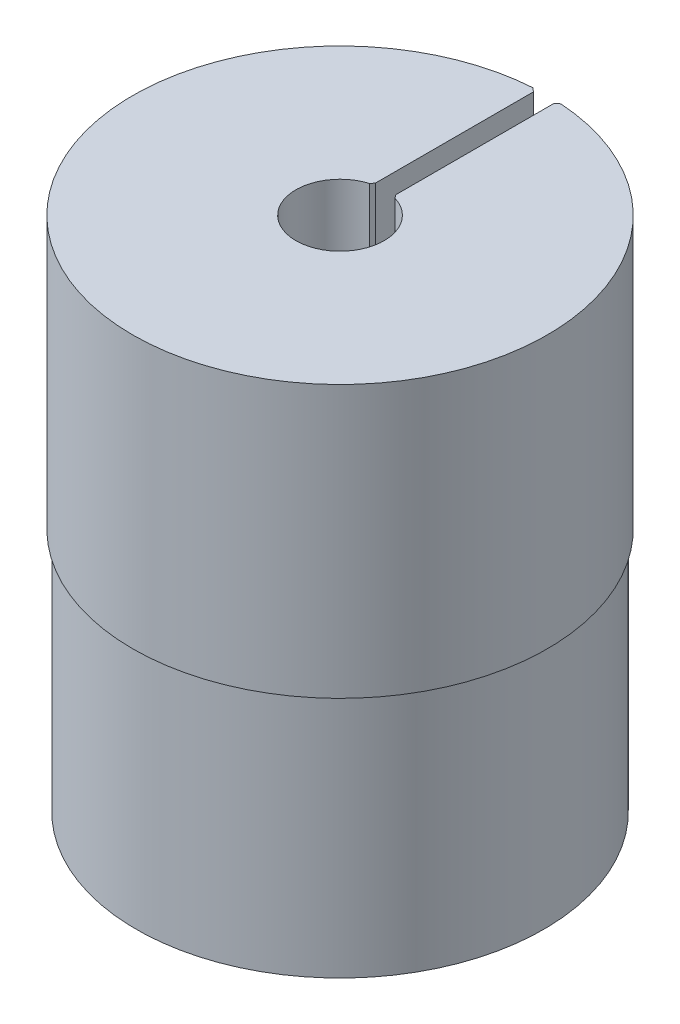
ISO-10303-21;
HEADER;
FILE_DESCRIPTION(('STEP AP214'),'2;1');
FILE_NAME('part.step','',(''),(''),'','','');
FILE_SCHEMA(('AUTOMOTIVE_DESIGN { 1 0 10303 214 1 1 1 1 }'));
ENDSEC;
DATA;
#1=APPLICATION_CONTEXT('core data for automotive mechanical design processes');
#2=APPLICATION_PROTOCOL_DEFINITION('international standard','automotive_design',2000,#1);
#3=PRODUCT_CONTEXT('',#1,'mechanical');
#4=PRODUCT('Part','Part','',(#3));
#5=PRODUCT_RELATED_PRODUCT_CATEGORY('part','',(#4));
#6=PRODUCT_DEFINITION_FORMATION('','',#4);
#7=PRODUCT_DEFINITION_CONTEXT('part definition',#1,'design');
#8=PRODUCT_DEFINITION('design','',#6,#7);
#9=PRODUCT_DEFINITION_SHAPE('','',#8);
#10=(LENGTH_UNIT() NAMED_UNIT(*) SI_UNIT(.MILLI.,.METRE.));
#11=(NAMED_UNIT(*) PLANE_ANGLE_UNIT() SI_UNIT($,.RADIAN.));
#12=(NAMED_UNIT(*) SI_UNIT($,.STERADIAN.) SOLID_ANGLE_UNIT());
#13=UNCERTAINTY_MEASURE_WITH_UNIT(LENGTH_MEASURE(1.E-05),#10,'distance_accuracy_value','');
#14=(GEOMETRIC_REPRESENTATION_CONTEXT(3) GLOBAL_UNCERTAINTY_ASSIGNED_CONTEXT((#13)) GLOBAL_UNIT_ASSIGNED_CONTEXT((#10,
#11,#12)) REPRESENTATION_CONTEXT('',''));
#15=CARTESIAN_POINT('',(0.,0.,0.));
#16=DIRECTION('',(0.,0.,1.));
#17=DIRECTION('',(1.,0.,0.));
#18=AXIS2_PLACEMENT_3D('',#15,#16,#17);
#19=CARTESIAN_POINT('',(0.,9.,0.));
#20=DIRECTION('',(0.,-1.,0.));
#21=DIRECTION('',(0.,0.,-1.));
#22=AXIS2_PLACEMENT_3D('',#19,#20,#21);
#23=CYLINDRICAL_SURFACE('',#22,7.5);
#24=CARTESIAN_POINT('',(0.,0.,0.));
#25=DIRECTION('',(0.,1.,0.));
#26=DIRECTION('',(0.,0.,1.));
#27=AXIS2_PLACEMENT_3D('',#24,#25,#26);
#28=CIRCLE('',#27,7.5);
#29=CARTESIAN_POINT('',(-0.500000000000001,0.,-7.48331477354788));
#30=VERTEX_POINT('',#29);
#31=CARTESIAN_POINT('',(0.499999999999999,0.,-7.48331477354788));
#32=VERTEX_POINT('',#31);
#33=EDGE_CURVE('E214',#30,#32,#28,.T.);
#34=ORIENTED_EDGE('',*,*,#33,.T.);
#35=DIRECTION('',(0.,-1.,0.));
#36=VECTOR('',#35,1.);
#37=CARTESIAN_POINT('',(0.499999999999999,9.,-7.48331477354788));
#38=LINE('',#37,#36);
#39=CARTESIAN_POINT('',(0.499999999999999,9.,-7.48331477354788));
#40=VERTEX_POINT('',#39);
#41=EDGE_CURVE('E207',#32,#40,#38,.F.);
#42=ORIENTED_EDGE('',*,*,#41,.T.);
#43=CARTESIAN_POINT('',(0.,9.,0.));
#44=DIRECTION('',(0.,1.,0.));
#45=DIRECTION('',(0.,0.,1.));
#46=AXIS2_PLACEMENT_3D('',#43,#44,#45);
#47=CIRCLE('',#46,7.5);
#48=CARTESIAN_POINT('',(-0.500000000000001,9.,-7.48331477354788));
#49=VERTEX_POINT('',#48);
#50=EDGE_CURVE('E217',#49,#40,#47,.T.);
#51=ORIENTED_EDGE('',*,*,#50,.F.);
#52=DIRECTION('',(0.,-1.,0.));
#53=VECTOR('',#52,1.);
#54=CARTESIAN_POINT('',(-0.500000000000001,9.,-7.48331477354788));
#55=LINE('',#54,#53);
#56=EDGE_CURVE('E201',#49,#30,#55,.T.);
#57=ORIENTED_EDGE('',*,*,#56,.T.);
#58=EDGE_LOOP('',(#34,#42,#51,#57));
#59=FACE_BOUND('',#58,.T.);
#60=ADVANCED_FACE('F35',(#59),#23,.T.);
#61=CARTESIAN_POINT('',(0.,0.,0.));
#62=DIRECTION('',(0.,1.,0.));
#63=DIRECTION('',(0.,0.,1.));
#64=AXIS2_PLACEMENT_3D('',#61,#62,#63);
#65=PLANE('',#64);
#66=CARTESIAN_POINT('',(0.,0.,0.));
#67=DIRECTION('',(0.,1.,0.));
#68=DIRECTION('',(0.,0.,1.));
#69=AXIS2_PLACEMENT_3D('',#66,#67,#68);
#70=CIRCLE('',#69,1.75);
#71=CARTESIAN_POINT('',(-0.5,0.,-1.67705098312484));
#72=VERTEX_POINT('',#71);
#73=CARTESIAN_POINT('',(0.5,0.,-1.67705098312484));
#74=VERTEX_POINT('',#73);
#75=EDGE_CURVE('E211',#72,#74,#70,.T.);
#76=ORIENTED_EDGE('',*,*,#75,.T.);
#77=DIRECTION('',(0.,0.,-1.));
#78=VECTOR('',#77,1.);
#79=CARTESIAN_POINT('',(0.499999999999999,0.,-7.76458951533139));
#80=LINE('',#79,#78);
#81=EDGE_CURVE('E49',#74,#32,#80,.T.);
#82=ORIENTED_EDGE('',*,*,#81,.T.);
#83=ORIENTED_EDGE('',*,*,#33,.F.);
#84=DIRECTION('',(0.,0.,1.));
#85=VECTOR('',#84,1.);
#86=CARTESIAN_POINT('',(-0.500000000000001,0.,-7.76458951533139));
#87=LINE('',#86,#85);
#88=EDGE_CURVE('E198',#30,#72,#87,.T.);
#89=ORIENTED_EDGE('',*,*,#88,.T.);
#90=EDGE_LOOP('',(#76,#82,#83,#89));
#91=FACE_BOUND('',#90,.T.);
#92=ADVANCED_FACE('F224',(#91),#65,.F.);
#93=CARTESIAN_POINT('',(0.,0.,0.));
#94=DIRECTION('',(0.,1.,0.));
#95=DIRECTION('',(0.,0.,1.));
#96=AXIS2_PLACEMENT_3D('',#93,#94,#95);
#97=CYLINDRICAL_SURFACE('',#96,1.75);
#98=CARTESIAN_POINT('',(0.,9.,0.));
#99=DIRECTION('',(0.,1.,0.));
#100=DIRECTION('',(0.,0.,1.));
#101=AXIS2_PLACEMENT_3D('',#98,#99,#100);
#102=CIRCLE('',#101,1.75);
#103=CARTESIAN_POINT('',(-0.5,9.,-1.67705098312484));
#104=VERTEX_POINT('',#103);
#105=CARTESIAN_POINT('',(0.5,9.,-1.67705098312484));
#106=VERTEX_POINT('',#105);
#107=EDGE_CURVE('E210',#104,#106,#102,.T.);
#108=ORIENTED_EDGE('',*,*,#107,.T.);
#109=DIRECTION('',(0.,1.,0.));
#110=VECTOR('',#109,1.);
#111=CARTESIAN_POINT('',(0.5,0.,-1.67705098312484));
#112=LINE('',#111,#110);
#113=EDGE_CURVE('E11',#106,#74,#112,.F.);
#114=ORIENTED_EDGE('',*,*,#113,.T.);
#115=ORIENTED_EDGE('',*,*,#75,.F.);
#116=DIRECTION('',(0.,1.,0.));
#117=VECTOR('',#116,1.);
#118=CARTESIAN_POINT('',(-0.5,0.,-1.67705098312484));
#119=LINE('',#118,#117);
#120=EDGE_CURVE('E42',#72,#104,#119,.T.);
#121=ORIENTED_EDGE('',*,*,#120,.T.);
#122=EDGE_LOOP('',(#108,#114,#115,#121));
#123=FACE_BOUND('',#122,.T.);
#124=ADVANCED_FACE('F222',(#123),#97,.F.);
#125=CARTESIAN_POINT('',(-0.500000000000001,0.,-7.76458951533139));
#126=DIRECTION('',(-1.,0.,0.));
#127=DIRECTION('',(0.,0.,1.));
#128=AXIS2_PLACEMENT_3D('',#125,#126,#127);
#129=PLANE('',#128);
#130=DIRECTION('',(0.,0.,1.));
#131=VECTOR('',#130,1.);
#132=CARTESIAN_POINT('',(-0.500000000000001,9.,-7.76458951533139));
#133=LINE('',#132,#131);
#134=EDGE_CURVE('E199',#49,#104,#133,.T.);
#135=ORIENTED_EDGE('',*,*,#134,.T.);
#136=ORIENTED_EDGE('',*,*,#120,.F.);
#137=ORIENTED_EDGE('',*,*,#88,.F.);
#138=ORIENTED_EDGE('',*,*,#56,.F.);
#139=EDGE_LOOP('',(#135,#136,#137,#138));
#140=FACE_BOUND('',#139,.T.);
#141=ADVANCED_FACE('F227',(#140),#129,.F.);
#142=CARTESIAN_POINT('',(0.499999999999999,0.,-7.76458951533139));
#143=DIRECTION('',(1.,0.,0.));
#144=DIRECTION('',(0.,0.,-1.));
#145=AXIS2_PLACEMENT_3D('',#142,#143,#144);
#146=PLANE('',#145);
#147=ORIENTED_EDGE('',*,*,#81,.F.);
#148=ORIENTED_EDGE('',*,*,#113,.F.);
#149=DIRECTION('',(0.,0.,-1.));
#150=VECTOR('',#149,1.);
#151=CARTESIAN_POINT('',(0.499999999999999,9.,-7.76458951533139));
#152=LINE('',#151,#150);
#153=EDGE_CURVE('E134',#106,#40,#152,.T.);
#154=ORIENTED_EDGE('',*,*,#153,.T.);
#155=ORIENTED_EDGE('',*,*,#41,.F.);
#156=EDGE_LOOP('',(#147,#148,#154,#155));
#157=FACE_BOUND('',#156,.T.);
#158=ADVANCED_FACE('F232',(#157),#146,.F.);
#159=CARTESIAN_POINT('',(0.,9.,0.));
#160=DIRECTION('',(0.,1.,0.));
#161=DIRECTION('',(0.,0.,1.));
#162=AXIS2_PLACEMENT_3D('',#159,#160,#161);
#163=PLANE('',#162);
#164=CARTESIAN_POINT('',(0.,9.,0.));
#165=DIRECTION('',(0.,1.,0.));
#166=DIRECTION('',(0.,0.,1.));
#167=AXIS2_PLACEMENT_3D('',#164,#165,#166);
#168=CIRCLE('',#167,1.623);
#169=CARTESIAN_POINT('',(-0.463714285714286,9.,-1.55534499749235));
#170=VERTEX_POINT('',#169);
#171=CARTESIAN_POINT('',(0.463714285714285,9.,-1.55534499749235));
#172=VERTEX_POINT('',#171);
#173=EDGE_CURVE('E130',#170,#172,#168,.T.);
#174=ORIENTED_EDGE('',*,*,#173,.T.);
#175=DIRECTION('',(-0.597614304667196,0.,-0.801783725737274));
#176=VECTOR('',#175,1.);
#177=CARTESIAN_POINT('',(1.04335714285714,9.,-0.777672498746174));
#178=LINE('',#177,#176);
#179=CARTESIAN_POINT('',(0.373,9.,-1.67705098312484));
#180=VERTEX_POINT('',#179);
#181=EDGE_CURVE('E149',#172,#180,#178,.T.);
#182=ORIENTED_EDGE('',*,*,#181,.T.);
#183=DIRECTION('',(0.,0.,-1.));
#184=VECTOR('',#183,1.);
#185=CARTESIAN_POINT('',(0.373,9.,0.));
#186=LINE('',#185,#184);
#187=CARTESIAN_POINT('',(0.372999999999999,9.,-7.48331477354788));
#188=VERTEX_POINT('',#187);
#189=EDGE_CURVE('E152',#180,#188,#186,.T.);
#190=ORIENTED_EDGE('',*,*,#189,.T.);
#191=DIRECTION('',(0.730296743340216,0.,-0.683130051063979));
#192=VECTOR('',#191,1.);
#193=CARTESIAN_POINT('',(-3.55926666666667,9.,-3.80501611852325));
#194=LINE('',#193,#192);
#195=CARTESIAN_POINT('',(0.508466666666665,9.,-7.61003223704663));
#196=VERTEX_POINT('',#195);
#197=EDGE_CURVE('E179',#188,#196,#194,.T.);
#198=ORIENTED_EDGE('',*,*,#197,.T.);
#199=CARTESIAN_POINT('',(0.,9.,0.));
#200=DIRECTION('',(0.,1.,0.));
#201=DIRECTION('',(0.,0.,1.));
#202=AXIS2_PLACEMENT_3D('',#199,#200,#201);
#203=CIRCLE('',#202,7.627);
#204=CARTESIAN_POINT('',(-0.508466666666668,9.,-7.61003223704663));
#205=VERTEX_POINT('',#204);
#206=EDGE_CURVE('E176',#205,#196,#203,.T.);
#207=ORIENTED_EDGE('',*,*,#206,.F.);
#208=DIRECTION('',(-0.730296743340219,0.,-0.683130051063976));
#209=VECTOR('',#208,1.);
#210=CARTESIAN_POINT('',(3.55926666666667,9.,-3.80501611852329));
#211=LINE('',#210,#209);
#212=CARTESIAN_POINT('',(-0.373000000000001,9.,-7.48331477354788));
#213=VERTEX_POINT('',#212);
#214=EDGE_CURVE('E174',#213,#205,#211,.T.);
#215=ORIENTED_EDGE('',*,*,#214,.F.);
#216=DIRECTION('',(0.,0.,1.));
#217=VECTOR('',#216,1.);
#218=CARTESIAN_POINT('',(-0.373,9.,0.));
#219=LINE('',#218,#217);
#220=CARTESIAN_POINT('',(-0.373,9.,-1.67705098312484));
#221=VERTEX_POINT('',#220);
#222=EDGE_CURVE('E171',#213,#221,#219,.T.);
#223=ORIENTED_EDGE('',*,*,#222,.T.);
#224=DIRECTION('',(0.597614304667197,0.,-0.801783725737273));
#225=VECTOR('',#224,1.);
#226=CARTESIAN_POINT('',(-1.04335714285714,9.,-0.777672498746178));
#227=LINE('',#226,#225);
#228=EDGE_CURVE('E169',#170,#221,#227,.T.);
#229=ORIENTED_EDGE('',*,*,#228,.F.);
#230=EDGE_LOOP('',(#174,#182,#190,#198,#207,#215,#223,#229));
#231=FACE_BOUND('',#230,.T.);
#232=ORIENTED_EDGE('',*,*,#107,.F.);
#233=ORIENTED_EDGE('',*,*,#134,.F.);
#234=ORIENTED_EDGE('',*,*,#50,.T.);
#235=ORIENTED_EDGE('',*,*,#153,.F.);
#236=EDGE_LOOP('',(#232,#233,#234,#235));
#237=FACE_BOUND('',#236,.T.);
#238=ADVANCED_FACE('F231',(#231,#237),#163,.F.);
#239=CARTESIAN_POINT('',(0.,19.,0.));
#240=DIRECTION('',(0.,-1.,0.));
#241=DIRECTION('',(0.,0.,-1.));
#242=AXIS2_PLACEMENT_3D('',#239,#240,#241);
#243=CYLINDRICAL_SURFACE('',#242,1.623);
#244=ORIENTED_EDGE('',*,*,#173,.F.);
#245=DIRECTION('',(0.,-1.,0.));
#246=VECTOR('',#245,1.);
#247=CARTESIAN_POINT('',(-0.463714285714286,19.,-1.55534499749235));
#248=LINE('',#247,#246);
#249=CARTESIAN_POINT('',(-0.463714285714286,19.,-1.55534499749235));
#250=VERTEX_POINT('',#249);
#251=EDGE_CURVE('E123',#250,#170,#248,.T.);
#252=ORIENTED_EDGE('',*,*,#251,.F.);
#253=CARTESIAN_POINT('',(0.,19.,0.));
#254=DIRECTION('',(0.,1.,0.));
#255=DIRECTION('',(0.,0.,1.));
#256=AXIS2_PLACEMENT_3D('',#253,#254,#255);
#257=CIRCLE('',#256,1.623);
#258=CARTESIAN_POINT('',(0.463714285714285,19.,-1.55534499749235));
#259=VERTEX_POINT('',#258);
#260=EDGE_CURVE('E127',#250,#259,#257,.T.);
#261=ORIENTED_EDGE('',*,*,#260,.T.);
#262=DIRECTION('',(0.,-1.,0.));
#263=VECTOR('',#262,1.);
#264=CARTESIAN_POINT('',(0.463714285714285,19.,-1.55534499749235));
#265=LINE('',#264,#263);
#266=EDGE_CURVE('E167',#259,#172,#265,.T.);
#267=ORIENTED_EDGE('',*,*,#266,.T.);
#268=EDGE_LOOP('',(#244,#252,#261,#267));
#269=FACE_BOUND('',#268,.T.);
#270=ADVANCED_FACE('F125',(#269),#243,.F.);
#271=CARTESIAN_POINT('',(-1.04335714285714,19.,-0.777672498746178));
#272=DIRECTION('',(-0.801783725737273,0.,-0.597614304667197));
#273=DIRECTION('',(-0.597614304667197,0.,0.801783725737273));
#274=AXIS2_PLACEMENT_3D('',#271,#272,#273);
#275=PLANE('',#274);
#276=ORIENTED_EDGE('',*,*,#228,.T.);
#277=DIRECTION('',(0.,-1.,0.));
#278=VECTOR('',#277,1.);
#279=CARTESIAN_POINT('',(-0.373,19.,-1.67705098312484));
#280=LINE('',#279,#278);
#281=CARTESIAN_POINT('',(-0.373,19.,-1.67705098312484));
#282=VERTEX_POINT('',#281);
#283=EDGE_CURVE('E135',#282,#221,#280,.T.);
#284=ORIENTED_EDGE('',*,*,#283,.F.);
#285=DIRECTION('',(0.597614304667197,0.,-0.801783725737273));
#286=VECTOR('',#285,1.);
#287=CARTESIAN_POINT('',(-1.04335714285714,19.,-0.777672498746178));
#288=LINE('',#287,#286);
#289=EDGE_CURVE('E138',#250,#282,#288,.T.);
#290=ORIENTED_EDGE('',*,*,#289,.F.);
#291=ORIENTED_EDGE('',*,*,#251,.T.);
#292=EDGE_LOOP('',(#276,#284,#290,#291));
#293=FACE_BOUND('',#292,.T.);
#294=ADVANCED_FACE('F139',(#293),#275,.F.);
#295=CARTESIAN_POINT('',(-0.373,19.,0.));
#296=DIRECTION('',(1.,0.,0.));
#297=DIRECTION('',(0.,0.,-1.));
#298=AXIS2_PLACEMENT_3D('',#295,#296,#297);
#299=PLANE('',#298);
#300=ORIENTED_EDGE('',*,*,#222,.F.);
#301=DIRECTION('',(0.,-1.,0.));
#302=VECTOR('',#301,1.);
#303=CARTESIAN_POINT('',(-0.373000000000001,19.,-7.48331477354788));
#304=LINE('',#303,#302);
#305=CARTESIAN_POINT('',(-0.373000000000001,19.,-7.48331477354788));
#306=VERTEX_POINT('',#305);
#307=EDGE_CURVE('E194',#306,#213,#304,.T.);
#308=ORIENTED_EDGE('',*,*,#307,.F.);
#309=DIRECTION('',(0.,0.,1.));
#310=VECTOR('',#309,1.);
#311=CARTESIAN_POINT('',(-0.373,19.,0.));
#312=LINE('',#311,#310);
#313=EDGE_CURVE('E143',#306,#282,#312,.T.);
#314=ORIENTED_EDGE('',*,*,#313,.T.);
#315=ORIENTED_EDGE('',*,*,#283,.T.);
#316=EDGE_LOOP('',(#300,#308,#314,#315));
#317=FACE_BOUND('',#316,.T.);
#318=ADVANCED_FACE('F283',(#317),#299,.T.);
#319=CARTESIAN_POINT('',(3.55926666666667,19.,-3.80501611852329));
#320=DIRECTION('',(-0.683130051063976,0.,0.730296743340219));
#321=DIRECTION('',(0.730296743340219,0.,0.683130051063976));
#322=AXIS2_PLACEMENT_3D('',#319,#320,#321);
#323=PLANE('',#322);
#324=ORIENTED_EDGE('',*,*,#214,.T.);
#325=DIRECTION('',(0.,-1.,0.));
#326=VECTOR('',#325,1.);
#327=CARTESIAN_POINT('',(-0.508466666666668,19.,-7.61003223704663));
#328=LINE('',#327,#326);
#329=CARTESIAN_POINT('',(-0.508466666666668,19.,-7.61003223704663));
#330=VERTEX_POINT('',#329);
#331=EDGE_CURVE('E191',#330,#205,#328,.T.);
#332=ORIENTED_EDGE('',*,*,#331,.F.);
#333=DIRECTION('',(-0.730296743340219,0.,-0.683130051063976));
#334=VECTOR('',#333,1.);
#335=CARTESIAN_POINT('',(3.55926666666667,19.,-3.80501611852329));
#336=LINE('',#335,#334);
#337=EDGE_CURVE('E156',#306,#330,#336,.T.);
#338=ORIENTED_EDGE('',*,*,#337,.F.);
#339=ORIENTED_EDGE('',*,*,#307,.T.);
#340=EDGE_LOOP('',(#324,#332,#338,#339));
#341=FACE_BOUND('',#340,.T.);
#342=ADVANCED_FACE('F292',(#341),#323,.F.);
#343=CARTESIAN_POINT('',(0.,19.,0.));
#344=DIRECTION('',(0.,-1.,0.));
#345=DIRECTION('',(0.,0.,-1.));
#346=AXIS2_PLACEMENT_3D('',#343,#344,#345);
#347=CYLINDRICAL_SURFACE('',#346,7.627);
#348=ORIENTED_EDGE('',*,*,#206,.T.);
#349=DIRECTION('',(0.,-1.,0.));
#350=VECTOR('',#349,1.);
#351=CARTESIAN_POINT('',(0.508466666666665,19.,-7.61003223704663));
#352=LINE('',#351,#350);
#353=CARTESIAN_POINT('',(0.508466666666665,19.,-7.61003223704663));
#354=VERTEX_POINT('',#353);
#355=EDGE_CURVE('E189',#354,#196,#352,.T.);
#356=ORIENTED_EDGE('',*,*,#355,.F.);
#357=CARTESIAN_POINT('',(0.,19.,0.));
#358=DIRECTION('',(0.,1.,0.));
#359=DIRECTION('',(0.,0.,1.));
#360=AXIS2_PLACEMENT_3D('',#357,#358,#359);
#361=CIRCLE('',#360,7.627);
#362=EDGE_CURVE('E158',#330,#354,#361,.T.);
#363=ORIENTED_EDGE('',*,*,#362,.F.);
#364=ORIENTED_EDGE('',*,*,#331,.T.);
#365=EDGE_LOOP('',(#348,#356,#363,#364));
#366=FACE_BOUND('',#365,.T.);
#367=ADVANCED_FACE('F302',(#366),#347,.T.);
#368=CARTESIAN_POINT('',(-3.55926666666667,19.,-3.80501611852325));
#369=DIRECTION('',(-0.683130051063979,0.,-0.730296743340216));
#370=DIRECTION('',(-0.730296743340216,0.,0.683130051063979));
#371=AXIS2_PLACEMENT_3D('',#368,#369,#370);
#372=PLANE('',#371);
#373=ORIENTED_EDGE('',*,*,#197,.F.);
#374=DIRECTION('',(0.,-1.,0.));
#375=VECTOR('',#374,1.);
#376=CARTESIAN_POINT('',(0.372999999999999,19.,-7.48331477354788));
#377=LINE('',#376,#375);
#378=CARTESIAN_POINT('',(0.372999999999999,19.,-7.48331477354788));
#379=VERTEX_POINT('',#378);
#380=EDGE_CURVE('E187',#379,#188,#377,.T.);
#381=ORIENTED_EDGE('',*,*,#380,.F.);
#382=DIRECTION('',(0.730296743340216,0.,-0.683130051063979));
#383=VECTOR('',#382,1.);
#384=CARTESIAN_POINT('',(-3.55926666666667,19.,-3.80501611852325));
#385=LINE('',#384,#383);
#386=EDGE_CURVE('E160',#379,#354,#385,.T.);
#387=ORIENTED_EDGE('',*,*,#386,.T.);
#388=ORIENTED_EDGE('',*,*,#355,.T.);
#389=EDGE_LOOP('',(#373,#381,#387,#388));
#390=FACE_BOUND('',#389,.T.);
#391=ADVANCED_FACE('F312',(#390),#372,.T.);
#392=CARTESIAN_POINT('',(0.373,19.,0.));
#393=DIRECTION('',(-1.,0.,0.));
#394=DIRECTION('',(0.,0.,1.));
#395=AXIS2_PLACEMENT_3D('',#392,#393,#394);
#396=PLANE('',#395);
#397=ORIENTED_EDGE('',*,*,#189,.F.);
#398=DIRECTION('',(0.,-1.,0.));
#399=VECTOR('',#398,1.);
#400=CARTESIAN_POINT('',(0.373,19.,-1.67705098312484));
#401=LINE('',#400,#399);
#402=CARTESIAN_POINT('',(0.373,19.,-1.67705098312484));
#403=VERTEX_POINT('',#402);
#404=EDGE_CURVE('E185',#403,#180,#401,.T.);
#405=ORIENTED_EDGE('',*,*,#404,.F.);
#406=DIRECTION('',(0.,0.,-1.));
#407=VECTOR('',#406,1.);
#408=CARTESIAN_POINT('',(0.373,19.,0.));
#409=LINE('',#408,#407);
#410=EDGE_CURVE('E163',#403,#379,#409,.T.);
#411=ORIENTED_EDGE('',*,*,#410,.T.);
#412=ORIENTED_EDGE('',*,*,#380,.T.);
#413=EDGE_LOOP('',(#397,#405,#411,#412));
#414=FACE_BOUND('',#413,.T.);
#415=ADVANCED_FACE('F322',(#414),#396,.T.);
#416=CARTESIAN_POINT('',(1.04335714285714,19.,-0.777672498746174));
#417=DIRECTION('',(-0.801783725737274,0.,0.597614304667196));
#418=DIRECTION('',(0.597614304667196,0.,0.801783725737274));
#419=AXIS2_PLACEMENT_3D('',#416,#417,#418);
#420=PLANE('',#419);
#421=ORIENTED_EDGE('',*,*,#181,.F.);
#422=ORIENTED_EDGE('',*,*,#266,.F.);
#423=DIRECTION('',(-0.597614304667196,0.,-0.801783725737274));
#424=VECTOR('',#423,1.);
#425=CARTESIAN_POINT('',(1.04335714285714,19.,-0.777672498746174));
#426=LINE('',#425,#424);
#427=EDGE_CURVE('E148',#259,#403,#426,.T.);
#428=ORIENTED_EDGE('',*,*,#427,.T.);
#429=ORIENTED_EDGE('',*,*,#404,.T.);
#430=EDGE_LOOP('',(#421,#422,#428,#429));
#431=FACE_BOUND('',#430,.T.);
#432=ADVANCED_FACE('F332',(#431),#420,.T.);
#433=CARTESIAN_POINT('',(0.,19.,0.));
#434=DIRECTION('',(0.,1.,0.));
#435=DIRECTION('',(0.,0.,1.));
#436=AXIS2_PLACEMENT_3D('',#433,#434,#435);
#437=PLANE('',#436);
#438=ORIENTED_EDGE('',*,*,#260,.F.);
#439=ORIENTED_EDGE('',*,*,#289,.T.);
#440=ORIENTED_EDGE('',*,*,#313,.F.);
#441=ORIENTED_EDGE('',*,*,#337,.T.);
#442=ORIENTED_EDGE('',*,*,#362,.T.);
#443=ORIENTED_EDGE('',*,*,#386,.F.);
#444=ORIENTED_EDGE('',*,*,#410,.F.);
#445=ORIENTED_EDGE('',*,*,#427,.F.);
#446=EDGE_LOOP('',(#438,#439,#440,#441,#442,#443,#444,#445));
#447=FACE_BOUND('',#446,.T.);
#448=ADVANCED_FACE('F145',(#447),#437,.T.);
#449=CLOSED_SHELL('',(#60,#92,#124,#141,#158,#238,#270,#294,#318,#342,#367,#391,#415,#432,#448));
#450=MANIFOLD_SOLID_BREP('B2',#449);
#451=ADVANCED_BREP_SHAPE_REPRESENTATION('',(#18,#450),#14);
#452=SHAPE_DEFINITION_REPRESENTATION(#9,#451);
ENDSEC;
END-ISO-10303-21;
